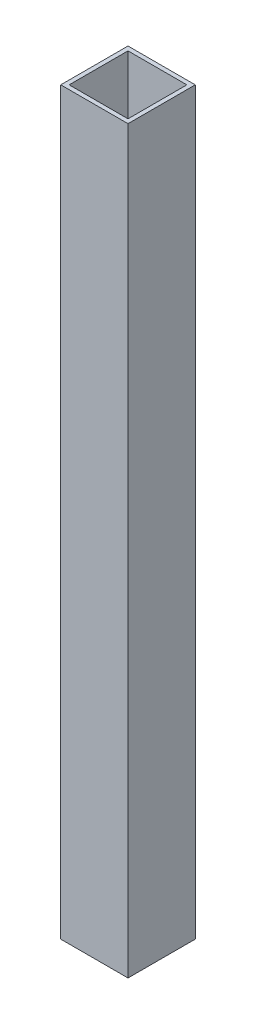
ISO-10303-21;
HEADER;
FILE_DESCRIPTION(('STEP AP214'),'2;1');
FILE_NAME('part.step','',(''),(''),'','','');
FILE_SCHEMA(('AUTOMOTIVE_DESIGN { 1 0 10303 214 1 1 1 1 }'));
ENDSEC;
DATA;
#1=APPLICATION_CONTEXT('core data for automotive mechanical design processes');
#2=APPLICATION_PROTOCOL_DEFINITION('international standard','automotive_design',2000,#1);
#3=PRODUCT_CONTEXT('',#1,'mechanical');
#4=PRODUCT('Part','Part','',(#3));
#5=PRODUCT_RELATED_PRODUCT_CATEGORY('part','',(#4));
#6=PRODUCT_DEFINITION_FORMATION('','',#4);
#7=PRODUCT_DEFINITION_CONTEXT('part definition',#1,'design');
#8=PRODUCT_DEFINITION('design','',#6,#7);
#9=PRODUCT_DEFINITION_SHAPE('','',#8);
#10=(LENGTH_UNIT() NAMED_UNIT(*) SI_UNIT(.MILLI.,.METRE.));
#11=(NAMED_UNIT(*) PLANE_ANGLE_UNIT() SI_UNIT($,.RADIAN.));
#12=(NAMED_UNIT(*) SI_UNIT($,.STERADIAN.) SOLID_ANGLE_UNIT());
#13=UNCERTAINTY_MEASURE_WITH_UNIT(LENGTH_MEASURE(1.E-05),#10,'distance_accuracy_value','');
#14=(GEOMETRIC_REPRESENTATION_CONTEXT(3) GLOBAL_UNCERTAINTY_ASSIGNED_CONTEXT((#13)) GLOBAL_UNIT_ASSIGNED_CONTEXT((#10,
#11,#12)) REPRESENTATION_CONTEXT('',''));
#15=CARTESIAN_POINT('',(0.,0.,0.));
#16=DIRECTION('',(0.,0.,1.));
#17=DIRECTION('',(1.,0.,0.));
#18=AXIS2_PLACEMENT_3D('',#15,#16,#17);
#19=CARTESIAN_POINT('',(0.,279.4,0.));
#20=DIRECTION('',(0.,-1.,0.));
#21=DIRECTION('',(0.,0.,-1.));
#22=AXIS2_PLACEMENT_3D('',#19,#20,#21);
#23=PLANE('',#22);
#24=DIRECTION('',(0.,0.,1.));
#25=VECTOR('',#24,1.);
#26=CARTESIAN_POINT('',(-12.7,279.4,-12.7));
#27=LINE('',#26,#25);
#28=CARTESIAN_POINT('',(-12.7,279.4,-12.7));
#29=VERTEX_POINT('',#28);
#30=CARTESIAN_POINT('',(-12.7,279.4,12.7));
#31=VERTEX_POINT('',#30);
#32=EDGE_CURVE('E134',#29,#31,#27,.T.);
#33=ORIENTED_EDGE('',*,*,#32,.T.);
#34=DIRECTION('',(1.,0.,0.));
#35=VECTOR('',#34,1.);
#36=CARTESIAN_POINT('',(12.7,279.4,12.7));
#37=LINE('',#36,#35);
#38=CARTESIAN_POINT('',(12.7,279.4,12.7));
#39=VERTEX_POINT('',#38);
#40=EDGE_CURVE('E137',#31,#39,#37,.T.);
#41=ORIENTED_EDGE('',*,*,#40,.T.);
#42=DIRECTION('',(0.,0.,-1.));
#43=VECTOR('',#42,1.);
#44=CARTESIAN_POINT('',(12.7,279.4,-12.7));
#45=LINE('',#44,#43);
#46=CARTESIAN_POINT('',(12.7,279.4,-12.7));
#47=VERTEX_POINT('',#46);
#48=EDGE_CURVE('E140',#39,#47,#45,.T.);
#49=ORIENTED_EDGE('',*,*,#48,.T.);
#50=DIRECTION('',(-1.,0.,0.));
#51=VECTOR('',#50,1.);
#52=CARTESIAN_POINT('',(12.7,279.4,-12.7));
#53=LINE('',#52,#51);
#54=EDGE_CURVE('E142',#47,#29,#53,.T.);
#55=ORIENTED_EDGE('',*,*,#54,.T.);
#56=EDGE_LOOP('',(#33,#41,#49,#55));
#57=FACE_BOUND('',#56,.T.);
#58=DIRECTION('',(0.,0.,1.));
#59=VECTOR('',#58,1.);
#60=CARTESIAN_POINT('',(-11.1125,279.4,-11.1125));
#61=LINE('',#60,#59);
#62=CARTESIAN_POINT('',(-11.1125,279.4,-11.1125));
#63=VERTEX_POINT('',#62);
#64=CARTESIAN_POINT('',(-11.1125,279.4,11.1125));
#65=VERTEX_POINT('',#64);
#66=EDGE_CURVE('E98',#63,#65,#61,.T.);
#67=ORIENTED_EDGE('',*,*,#66,.F.);
#68=DIRECTION('',(-1.,0.,0.));
#69=VECTOR('',#68,1.);
#70=CARTESIAN_POINT('',(11.1125,279.4,-11.1125));
#71=LINE('',#70,#69);
#72=CARTESIAN_POINT('',(11.1125,279.4,-11.1125));
#73=VERTEX_POINT('',#72);
#74=EDGE_CURVE('E120',#73,#63,#71,.T.);
#75=ORIENTED_EDGE('',*,*,#74,.F.);
#76=DIRECTION('',(0.,0.,-1.));
#77=VECTOR('',#76,1.);
#78=CARTESIAN_POINT('',(11.1125,279.4,-11.1125));
#79=LINE('',#78,#77);
#80=CARTESIAN_POINT('',(11.1125,279.4,11.1125));
#81=VERTEX_POINT('',#80);
#82=EDGE_CURVE('E118',#81,#73,#79,.T.);
#83=ORIENTED_EDGE('',*,*,#82,.F.);
#84=DIRECTION('',(1.,0.,0.));
#85=VECTOR('',#84,1.);
#86=CARTESIAN_POINT('',(11.1125,279.4,11.1125));
#87=LINE('',#86,#85);
#88=EDGE_CURVE('E106',#65,#81,#87,.T.);
#89=ORIENTED_EDGE('',*,*,#88,.F.);
#90=EDGE_LOOP('',(#67,#75,#83,#89));
#91=FACE_BOUND('',#90,.T.);
#92=ADVANCED_FACE('F33',(#57,#91),#23,.F.);
#93=CARTESIAN_POINT('',(0.,0.,0.));
#94=DIRECTION('',(0.,-1.,0.));
#95=DIRECTION('',(0.,0.,-1.));
#96=AXIS2_PLACEMENT_3D('',#93,#94,#95);
#97=PLANE('',#96);
#98=DIRECTION('',(0.,0.,1.));
#99=VECTOR('',#98,1.);
#100=CARTESIAN_POINT('',(-12.7,0.,-12.7));
#101=LINE('',#100,#99);
#102=CARTESIAN_POINT('',(-12.7,0.,-12.7));
#103=VERTEX_POINT('',#102);
#104=CARTESIAN_POINT('',(-12.7,0.,12.7));
#105=VERTEX_POINT('',#104);
#106=EDGE_CURVE('E114',#103,#105,#101,.T.);
#107=ORIENTED_EDGE('',*,*,#106,.F.);
#108=DIRECTION('',(-1.,0.,0.));
#109=VECTOR('',#108,1.);
#110=CARTESIAN_POINT('',(12.7,0.,-12.7));
#111=LINE('',#110,#109);
#112=CARTESIAN_POINT('',(12.7,0.,-12.7));
#113=VERTEX_POINT('',#112);
#114=EDGE_CURVE('E138',#113,#103,#111,.T.);
#115=ORIENTED_EDGE('',*,*,#114,.F.);
#116=DIRECTION('',(0.,0.,-1.));
#117=VECTOR('',#116,1.);
#118=CARTESIAN_POINT('',(12.7,0.,-12.7));
#119=LINE('',#118,#117);
#120=CARTESIAN_POINT('',(12.7,0.,12.7));
#121=VERTEX_POINT('',#120);
#122=EDGE_CURVE('E149',#121,#113,#119,.T.);
#123=ORIENTED_EDGE('',*,*,#122,.F.);
#124=DIRECTION('',(1.,0.,0.));
#125=VECTOR('',#124,1.);
#126=CARTESIAN_POINT('',(12.7,0.,12.7));
#127=LINE('',#126,#125);
#128=EDGE_CURVE('E147',#105,#121,#127,.T.);
#129=ORIENTED_EDGE('',*,*,#128,.F.);
#130=EDGE_LOOP('',(#107,#115,#123,#129));
#131=FACE_BOUND('',#130,.T.);
#132=DIRECTION('',(-1.,0.,0.));
#133=VECTOR('',#132,1.);
#134=CARTESIAN_POINT('',(11.1125,0.,-11.1125));
#135=LINE('',#134,#133);
#136=CARTESIAN_POINT('',(11.1125,0.,-11.1125));
#137=VERTEX_POINT('',#136);
#138=CARTESIAN_POINT('',(-11.1125,0.,-11.1125));
#139=VERTEX_POINT('',#138);
#140=EDGE_CURVE('E107',#137,#139,#135,.T.);
#141=ORIENTED_EDGE('',*,*,#140,.T.);
#142=DIRECTION('',(0.,0.,1.));
#143=VECTOR('',#142,1.);
#144=CARTESIAN_POINT('',(-11.1125,0.,-11.1125));
#145=LINE('',#144,#143);
#146=CARTESIAN_POINT('',(-11.1125,0.,11.1125));
#147=VERTEX_POINT('',#146);
#148=EDGE_CURVE('E56',#139,#147,#145,.T.);
#149=ORIENTED_EDGE('',*,*,#148,.T.);
#150=DIRECTION('',(1.,0.,0.));
#151=VECTOR('',#150,1.);
#152=CARTESIAN_POINT('',(11.1125,0.,11.1125));
#153=LINE('',#152,#151);
#154=CARTESIAN_POINT('',(11.1125,0.,11.1125));
#155=VERTEX_POINT('',#154);
#156=EDGE_CURVE('E113',#147,#155,#153,.T.);
#157=ORIENTED_EDGE('',*,*,#156,.T.);
#158=DIRECTION('',(0.,0.,-1.));
#159=VECTOR('',#158,1.);
#160=CARTESIAN_POINT('',(11.1125,0.,-11.1125));
#161=LINE('',#160,#159);
#162=EDGE_CURVE('E126',#155,#137,#161,.T.);
#163=ORIENTED_EDGE('',*,*,#162,.T.);
#164=EDGE_LOOP('',(#141,#149,#157,#163));
#165=FACE_BOUND('',#164,.T.);
#166=ADVANCED_FACE('F167',(#131,#165),#97,.T.);
#167=CARTESIAN_POINT('',(-12.7,279.4,-12.7));
#168=DIRECTION('',(1.,0.,0.));
#169=DIRECTION('',(0.,0.,-1.));
#170=AXIS2_PLACEMENT_3D('',#167,#168,#169);
#171=PLANE('',#170);
#172=ORIENTED_EDGE('',*,*,#106,.T.);
#173=DIRECTION('',(0.,-1.,0.));
#174=VECTOR('',#173,1.);
#175=CARTESIAN_POINT('',(-12.7,279.4,12.7));
#176=LINE('',#175,#174);
#177=EDGE_CURVE('E11',#31,#105,#176,.T.);
#178=ORIENTED_EDGE('',*,*,#177,.F.);
#179=ORIENTED_EDGE('',*,*,#32,.F.);
#180=DIRECTION('',(0.,-1.,0.));
#181=VECTOR('',#180,1.);
#182=CARTESIAN_POINT('',(-12.7,279.4,-12.7));
#183=LINE('',#182,#181);
#184=EDGE_CURVE('E144',#29,#103,#183,.T.);
#185=ORIENTED_EDGE('',*,*,#184,.T.);
#186=EDGE_LOOP('',(#172,#178,#179,#185));
#187=FACE_BOUND('',#186,.T.);
#188=ADVANCED_FACE('F35',(#187),#171,.F.);
#189=CARTESIAN_POINT('',(12.7,279.4,12.7));
#190=DIRECTION('',(0.,0.,-1.));
#191=DIRECTION('',(-1.,0.,0.));
#192=AXIS2_PLACEMENT_3D('',#189,#190,#191);
#193=PLANE('',#192);
#194=ORIENTED_EDGE('',*,*,#128,.T.);
#195=DIRECTION('',(0.,-1.,0.));
#196=VECTOR('',#195,1.);
#197=CARTESIAN_POINT('',(12.7,279.4,12.7));
#198=LINE('',#197,#196);
#199=EDGE_CURVE('E41',#39,#121,#198,.T.);
#200=ORIENTED_EDGE('',*,*,#199,.F.);
#201=ORIENTED_EDGE('',*,*,#40,.F.);
#202=ORIENTED_EDGE('',*,*,#177,.T.);
#203=EDGE_LOOP('',(#194,#200,#201,#202));
#204=FACE_BOUND('',#203,.T.);
#205=ADVANCED_FACE('F177',(#204),#193,.F.);
#206=CARTESIAN_POINT('',(12.7,279.4,-12.7));
#207=DIRECTION('',(-1.,0.,0.));
#208=DIRECTION('',(0.,0.,1.));
#209=AXIS2_PLACEMENT_3D('',#206,#207,#208);
#210=PLANE('',#209);
#211=ORIENTED_EDGE('',*,*,#122,.T.);
#212=DIRECTION('',(0.,-1.,0.));
#213=VECTOR('',#212,1.);
#214=CARTESIAN_POINT('',(12.7,279.4,-12.7));
#215=LINE('',#214,#213);
#216=EDGE_CURVE('E154',#47,#113,#215,.T.);
#217=ORIENTED_EDGE('',*,*,#216,.F.);
#218=ORIENTED_EDGE('',*,*,#48,.F.);
#219=ORIENTED_EDGE('',*,*,#199,.T.);
#220=EDGE_LOOP('',(#211,#217,#218,#219));
#221=FACE_BOUND('',#220,.T.);
#222=ADVANCED_FACE('F161',(#221),#210,.F.);
#223=CARTESIAN_POINT('',(12.7,279.4,-12.7));
#224=DIRECTION('',(0.,0.,1.));
#225=DIRECTION('',(1.,0.,0.));
#226=AXIS2_PLACEMENT_3D('',#223,#224,#225);
#227=PLANE('',#226);
#228=ORIENTED_EDGE('',*,*,#114,.T.);
#229=ORIENTED_EDGE('',*,*,#184,.F.);
#230=ORIENTED_EDGE('',*,*,#54,.F.);
#231=ORIENTED_EDGE('',*,*,#216,.T.);
#232=EDGE_LOOP('',(#228,#229,#230,#231));
#233=FACE_BOUND('',#232,.T.);
#234=ADVANCED_FACE('F171',(#233),#227,.F.);
#235=CARTESIAN_POINT('',(-11.1125,279.4,-11.1125));
#236=DIRECTION('',(1.,0.,0.));
#237=DIRECTION('',(0.,0.,-1.));
#238=AXIS2_PLACEMENT_3D('',#235,#236,#237);
#239=PLANE('',#238);
#240=ORIENTED_EDGE('',*,*,#148,.F.);
#241=DIRECTION('',(0.,-1.,0.));
#242=VECTOR('',#241,1.);
#243=CARTESIAN_POINT('',(-11.1125,279.4,-11.1125));
#244=LINE('',#243,#242);
#245=EDGE_CURVE('E102',#63,#139,#244,.T.);
#246=ORIENTED_EDGE('',*,*,#245,.F.);
#247=ORIENTED_EDGE('',*,*,#66,.T.);
#248=DIRECTION('',(0.,-1.,0.));
#249=VECTOR('',#248,1.);
#250=CARTESIAN_POINT('',(-11.1125,279.4,11.1125));
#251=LINE('',#250,#249);
#252=EDGE_CURVE('E101',#65,#147,#251,.T.);
#253=ORIENTED_EDGE('',*,*,#252,.T.);
#254=EDGE_LOOP('',(#240,#246,#247,#253));
#255=FACE_BOUND('',#254,.T.);
#256=ADVANCED_FACE('F100',(#255),#239,.T.);
#257=CARTESIAN_POINT('',(11.1125,279.4,11.1125));
#258=DIRECTION('',(0.,0.,-1.));
#259=DIRECTION('',(-1.,0.,0.));
#260=AXIS2_PLACEMENT_3D('',#257,#258,#259);
#261=PLANE('',#260);
#262=ORIENTED_EDGE('',*,*,#156,.F.);
#263=ORIENTED_EDGE('',*,*,#252,.F.);
#264=ORIENTED_EDGE('',*,*,#88,.T.);
#265=DIRECTION('',(0.,-1.,0.));
#266=VECTOR('',#265,1.);
#267=CARTESIAN_POINT('',(11.1125,279.4,11.1125));
#268=LINE('',#267,#266);
#269=EDGE_CURVE('E115',#81,#155,#268,.T.);
#270=ORIENTED_EDGE('',*,*,#269,.T.);
#271=EDGE_LOOP('',(#262,#263,#264,#270));
#272=FACE_BOUND('',#271,.T.);
#273=ADVANCED_FACE('F110',(#272),#261,.T.);
#274=CARTESIAN_POINT('',(11.1125,279.4,-11.1125));
#275=DIRECTION('',(-1.,0.,0.));
#276=DIRECTION('',(0.,0.,1.));
#277=AXIS2_PLACEMENT_3D('',#274,#275,#276);
#278=PLANE('',#277);
#279=ORIENTED_EDGE('',*,*,#162,.F.);
#280=ORIENTED_EDGE('',*,*,#269,.F.);
#281=ORIENTED_EDGE('',*,*,#82,.T.);
#282=DIRECTION('',(0.,-1.,0.));
#283=VECTOR('',#282,1.);
#284=CARTESIAN_POINT('',(11.1125,279.4,-11.1125));
#285=LINE('',#284,#283);
#286=EDGE_CURVE('E48',#73,#137,#285,.T.);
#287=ORIENTED_EDGE('',*,*,#286,.T.);
#288=EDGE_LOOP('',(#279,#280,#281,#287));
#289=FACE_BOUND('',#288,.T.);
#290=ADVANCED_FACE('F200',(#289),#278,.T.);
#291=CARTESIAN_POINT('',(11.1125,279.4,-11.1125));
#292=DIRECTION('',(0.,0.,1.));
#293=DIRECTION('',(1.,0.,0.));
#294=AXIS2_PLACEMENT_3D('',#291,#292,#293);
#295=PLANE('',#294);
#296=ORIENTED_EDGE('',*,*,#140,.F.);
#297=ORIENTED_EDGE('',*,*,#286,.F.);
#298=ORIENTED_EDGE('',*,*,#74,.T.);
#299=ORIENTED_EDGE('',*,*,#245,.T.);
#300=EDGE_LOOP('',(#296,#297,#298,#299));
#301=FACE_BOUND('',#300,.T.);
#302=ADVANCED_FACE('F204',(#301),#295,.T.);
#303=CLOSED_SHELL('',(#92,#166,#188,#205,#222,#234,#256,#273,#290,#302));
#304=MANIFOLD_SOLID_BREP('B2',#303);
#305=ADVANCED_BREP_SHAPE_REPRESENTATION('',(#18,#304),#14);
#306=SHAPE_DEFINITION_REPRESENTATION(#9,#305);
ENDSEC;
END-ISO-10303-21;
